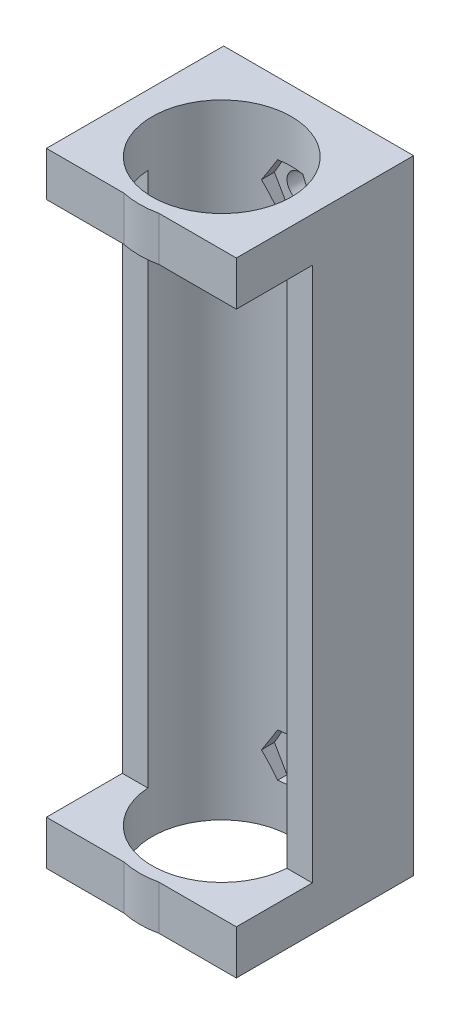
ISO-10303-21;
HEADER;
FILE_DESCRIPTION(('STEP AP214'),'2;1');
FILE_NAME('part.step','',(''),(''),'','','');
FILE_SCHEMA(('AUTOMOTIVE_DESIGN { 1 0 10303 214 1 1 1 1 }'));
ENDSEC;
DATA;
#1=APPLICATION_CONTEXT('core data for automotive mechanical design processes');
#2=APPLICATION_PROTOCOL_DEFINITION('international standard','automotive_design',2000,#1);
#3=PRODUCT_CONTEXT('',#1,'mechanical');
#4=PRODUCT('Part','Part','',(#3));
#5=PRODUCT_RELATED_PRODUCT_CATEGORY('part','',(#4));
#6=PRODUCT_DEFINITION_FORMATION('','',#4);
#7=PRODUCT_DEFINITION_CONTEXT('part definition',#1,'design');
#8=PRODUCT_DEFINITION('design','',#6,#7);
#9=PRODUCT_DEFINITION_SHAPE('','',#8);
#10=(LENGTH_UNIT() NAMED_UNIT(*) SI_UNIT(.MILLI.,.METRE.));
#11=(NAMED_UNIT(*) PLANE_ANGLE_UNIT() SI_UNIT($,.RADIAN.));
#12=(NAMED_UNIT(*) SI_UNIT($,.STERADIAN.) SOLID_ANGLE_UNIT());
#13=UNCERTAINTY_MEASURE_WITH_UNIT(LENGTH_MEASURE(1.E-05),#10,'distance_accuracy_value','');
#14=(GEOMETRIC_REPRESENTATION_CONTEXT(3) GLOBAL_UNCERTAINTY_ASSIGNED_CONTEXT((#13)) GLOBAL_UNIT_ASSIGNED_CONTEXT((#10,
#11,#12)) REPRESENTATION_CONTEXT('',''));
#15=CARTESIAN_POINT('',(0.,0.,0.));
#16=DIRECTION('',(0.,0.,1.));
#17=DIRECTION('',(1.,0.,0.));
#18=AXIS2_PLACEMENT_3D('',#15,#16,#17);
#19=CARTESIAN_POINT('',(-330.,-161.000000000004,4.));
#20=DIRECTION('',(0.,0.,-1.));
#21=DIRECTION('',(-1.,0.,0.));
#22=AXIS2_PLACEMENT_3D('',#19,#20,#21);
#23=CYLINDRICAL_SURFACE('',#22,2.);
#24=CARTESIAN_POINT('',(-330.,-161.000000000004,0.));
#25=DIRECTION('',(0.,0.,1.));
#26=DIRECTION('',(1.,0.,0.));
#27=AXIS2_PLACEMENT_3D('',#24,#25,#26);
#28=CIRCLE('',#27,2.);
#29=CARTESIAN_POINT('',(-328.,-161.000000000004,0.));
#30=VERTEX_POINT('',#29);
#31=EDGE_CURVE('E255',#30,#30,#28,.T.);
#32=ORIENTED_EDGE('',*,*,#31,.F.);
#33=EDGE_LOOP('',(#32));
#34=FACE_BOUND('',#33,.T.);
#35=CARTESIAN_POINT('',(-330.,-161.000000000004,3.));
#36=DIRECTION('',(0.,0.,1.));
#37=DIRECTION('',(1.,0.,0.));
#38=AXIS2_PLACEMENT_3D('',#35,#36,#37);
#39=CIRCLE('',#38,2.);
#40=CARTESIAN_POINT('',(-328.,-161.000000000004,3.));
#41=VERTEX_POINT('',#40);
#42=EDGE_CURVE('E40',#41,#41,#39,.T.);
#43=ORIENTED_EDGE('',*,*,#42,.T.);
#44=EDGE_LOOP('',(#43));
#45=FACE_BOUND('',#44,.T.);
#46=ADVANCED_FACE('F36',(#34,#45),#23,.F.);
#47=CARTESIAN_POINT('',(-330.,-238.999999999996,4.));
#48=DIRECTION('',(0.,0.,-1.));
#49=DIRECTION('',(-1.,0.,0.));
#50=AXIS2_PLACEMENT_3D('',#47,#48,#49);
#51=CYLINDRICAL_SURFACE('',#50,2.);
#52=CARTESIAN_POINT('',(-330.,-238.999999999996,0.));
#53=DIRECTION('',(0.,0.,1.));
#54=DIRECTION('',(1.,0.,0.));
#55=AXIS2_PLACEMENT_3D('',#52,#53,#54);
#56=CIRCLE('',#55,2.);
#57=CARTESIAN_POINT('',(-328.,-238.999999999996,0.));
#58=VERTEX_POINT('',#57);
#59=EDGE_CURVE('E251',#58,#58,#56,.T.);
#60=ORIENTED_EDGE('',*,*,#59,.F.);
#61=EDGE_LOOP('',(#60));
#62=FACE_BOUND('',#61,.T.);
#63=CARTESIAN_POINT('',(-330.,-238.999999999996,3.));
#64=DIRECTION('',(0.,0.,1.));
#65=DIRECTION('',(1.,0.,0.));
#66=AXIS2_PLACEMENT_3D('',#63,#64,#65);
#67=CIRCLE('',#66,2.);
#68=CARTESIAN_POINT('',(-328.,-238.999999999996,3.));
#69=VERTEX_POINT('',#68);
#70=EDGE_CURVE('E161',#69,#69,#67,.T.);
#71=ORIENTED_EDGE('',*,*,#70,.T.);
#72=EDGE_LOOP('',(#71));
#73=FACE_BOUND('',#72,.T.);
#74=ADVANCED_FACE('F527',(#62,#73),#51,.F.);
#75=CARTESIAN_POINT('',(-329.999999999999,-249.249999999996,15.3005851162431));
#76=DIRECTION('',(0.,1.,0.));
#77=DIRECTION('',(-1.,0.,0.));
#78=AXIS2_PLACEMENT_3D('',#75,#76,#77);
#79=CYLINDRICAL_SURFACE('',#78,11.);
#80=CARTESIAN_POINT('',(-329.999999999999,-235.549999999996,15.3005851162431));
#81=DIRECTION('',(0.,-1.,0.));
#82=DIRECTION('',(0.,0.,-1.));
#83=AXIS2_PLACEMENT_3D('',#80,#81,#82);
#84=CIRCLE('',#83,11.);
#85=CARTESIAN_POINT('',(-328.008141571296,-235.549999999996,4.48242908113241));
#86=VERTEX_POINT('',#85);
#87=CARTESIAN_POINT('',(-331.991858428704,-235.549999999996,4.48242908113259));
#88=VERTEX_POINT('',#87);
#89=EDGE_CURVE('E184',#86,#88,#84,.F.);
#90=ORIENTED_EDGE('',*,*,#89,.F.);
#91=CARTESIAN_POINT('',(-329.999999999999,-232.099999999997,15.3005851162431));
#92=DIRECTION('',(-0.866025403784441,-0.499999999999997,0.));
#93=DIRECTION('',(-0.499999999999997,0.866025403784441,0.));
#94=AXIS2_PLACEMENT_3D('',#91,#92,#93);
#95=ELLIPSE('',#94,22.,11.);
#96=CARTESIAN_POINT('',(-326.016283142591,-238.999999999996,5.04729296201264));
#97=VERTEX_POINT('',#96);
#98=EDGE_CURVE('E201',#97,#86,#95,.F.);
#99=ORIENTED_EDGE('',*,*,#98,.F.);
#100=CARTESIAN_POINT('',(-329.999999999999,-245.899999999995,15.3005851162431));
#101=DIRECTION('',(-0.866025403784441,0.499999999999997,0.));
#102=DIRECTION('',(0.499999999999997,0.866025403784441,0.));
#103=AXIS2_PLACEMENT_3D('',#100,#101,#102);
#104=ELLIPSE('',#103,22.0000000000003,11.);
#105=CARTESIAN_POINT('',(-328.008141571296,-242.449999999996,4.48242908113243));
#106=VERTEX_POINT('',#105);
#107=EDGE_CURVE('E197',#106,#97,#104,.F.);
#108=ORIENTED_EDGE('',*,*,#107,.F.);
#109=CARTESIAN_POINT('',(-329.999999999999,-242.449999999996,15.3005851162431));
#110=DIRECTION('',(0.,1.,0.));
#111=DIRECTION('',(-1.,0.,0.));
#112=AXIS2_PLACEMENT_3D('',#109,#110,#111);
#113=CIRCLE('',#112,11.);
#114=CARTESIAN_POINT('',(-331.991858428704,-242.449999999996,4.4824290811326));
#115=VERTEX_POINT('',#114);
#116=EDGE_CURVE('E194',#115,#106,#113,.F.);
#117=ORIENTED_EDGE('',*,*,#116,.F.);
#118=CARTESIAN_POINT('',(-329.999999999999,-245.899999999996,15.3005851162431));
#119=DIRECTION('',(0.866025403784434,0.500000000000009,0.));
#120=DIRECTION('',(-0.500000000000009,0.866025403784434,0.));
#121=AXIS2_PLACEMENT_3D('',#118,#119,#120);
#122=ELLIPSE('',#121,21.9999999999994,11.);
#123=CARTESIAN_POINT('',(-333.983716857408,-238.999999999996,5.04729296201301));
#124=VERTEX_POINT('',#123);
#125=EDGE_CURVE('E191',#124,#115,#122,.F.);
#126=ORIENTED_EDGE('',*,*,#125,.F.);
#127=CARTESIAN_POINT('',(-329.999999999999,-232.099999999995,15.3005851162431));
#128=DIRECTION('',(0.866025403784444,-0.499999999999991,0.));
#129=DIRECTION('',(0.499999999999991,0.866025403784444,0.));
#130=AXIS2_PLACEMENT_3D('',#127,#128,#129);
#131=ELLIPSE('',#130,22.0000000000006,11.);
#132=EDGE_CURVE('E188',#88,#124,#131,.F.);
#133=ORIENTED_EDGE('',*,*,#132,.F.);
#134=EDGE_LOOP('',(#90,#99,#108,#117,#126,#133));
#135=FACE_BOUND('',#134,.T.);
#136=CARTESIAN_POINT('',(-329.999999999999,-249.249999999996,15.3005851162431));
#137=DIRECTION('',(0.,-1.,0.));
#138=DIRECTION('',(1.,0.,0.));
#139=AXIS2_PLACEMENT_3D('',#136,#137,#138);
#140=CIRCLE('',#139,11.);
#141=CARTESIAN_POINT('',(-318.999999999999,-249.249999999996,15.3005851162431));
#142=VERTEX_POINT('',#141);
#143=EDGE_CURVE('E250',#142,#142,#140,.F.);
#144=ORIENTED_EDGE('',*,*,#143,.F.);
#145=EDGE_LOOP('',(#144));
#146=FACE_BOUND('',#145,.T.);
#147=CARTESIAN_POINT('',(-329.999999999999,-150.750000000004,15.300585116243));
#148=DIRECTION('',(0.,-1.,0.));
#149=DIRECTION('',(1.,0.,0.));
#150=AXIS2_PLACEMENT_3D('',#147,#148,#149);
#151=CIRCLE('',#150,11.);
#152=CARTESIAN_POINT('',(-318.999999999999,-150.750000000004,15.300585116243));
#153=VERTEX_POINT('',#152);
#154=EDGE_CURVE('E322',#153,#153,#151,.F.);
#155=ORIENTED_EDGE('',*,*,#154,.T.);
#156=EDGE_LOOP('',(#155));
#157=FACE_BOUND('',#156,.T.);
#158=CARTESIAN_POINT('',(-329.999999999999,-242.249999999996,15.3005851162431));
#159=DIRECTION('',(0.,-1.,0.));
#160=DIRECTION('',(0.,0.,-1.));
#161=AXIS2_PLACEMENT_3D('',#158,#159,#160);
#162=CIRCLE('',#161,11.);
#163=CARTESIAN_POINT('',(-319.022258027245,-242.249999999996,16.0000000000002));
#164=VERTEX_POINT('',#163);
#165=CARTESIAN_POINT('',(-340.977741972754,-242.249999999996,16.0000000000002));
#166=VERTEX_POINT('',#165);
#167=EDGE_CURVE('E317',#164,#166,#162,.T.);
#168=ORIENTED_EDGE('',*,*,#167,.F.);
#169=DIRECTION('',(0.,1.,0.));
#170=VECTOR('',#169,1.);
#171=CARTESIAN_POINT('',(-319.022258027245,-249.249999999996,16.0000000000002));
#172=LINE('',#171,#170);
#173=CARTESIAN_POINT('',(-319.022258027244,-157.750000000004,16.));
#174=VERTEX_POINT('',#173);
#175=EDGE_CURVE('E209',#174,#164,#172,.F.);
#176=ORIENTED_EDGE('',*,*,#175,.F.);
#177=CARTESIAN_POINT('',(-329.999999999999,-157.750000000004,15.300585116243));
#178=DIRECTION('',(0.,-1.,0.));
#179=DIRECTION('',(1.,0.,0.));
#180=AXIS2_PLACEMENT_3D('',#177,#178,#179);
#181=CIRCLE('',#180,11.);
#182=CARTESIAN_POINT('',(-340.977741972754,-157.750000000004,16.));
#183=VERTEX_POINT('',#182);
#184=EDGE_CURVE('E208',#174,#183,#181,.T.);
#185=ORIENTED_EDGE('',*,*,#184,.T.);
#186=DIRECTION('',(0.,1.,0.));
#187=VECTOR('',#186,1.);
#188=CARTESIAN_POINT('',(-340.977741972754,-249.249999999996,16.0000000000002));
#189=LINE('',#188,#187);
#190=EDGE_CURVE('E204',#166,#183,#189,.T.);
#191=ORIENTED_EDGE('',*,*,#190,.F.);
#192=EDGE_LOOP('',(#168,#176,#185,#191));
#193=FACE_BOUND('',#192,.T.);
#194=CARTESIAN_POINT('',(-329.999999999999,-164.450000000004,15.300585116243));
#195=DIRECTION('',(0.,1.,0.));
#196=DIRECTION('',(0.,0.,1.));
#197=AXIS2_PLACEMENT_3D('',#194,#195,#196);
#198=CIRCLE('',#197,11.);
#199=CARTESIAN_POINT('',(-331.991858428704,-164.450000000004,4.48242908113253));
#200=VERTEX_POINT('',#199);
#201=CARTESIAN_POINT('',(-328.008141571296,-164.450000000004,4.48242908113222));
#202=VERTEX_POINT('',#201);
#203=EDGE_CURVE('E59',#200,#202,#198,.F.);
#204=ORIENTED_EDGE('',*,*,#203,.F.);
#205=CARTESIAN_POINT('',(-329.999999999999,-167.900000000006,15.300585116243));
#206=DIRECTION('',(0.866025403784442,0.499999999999995,0.));
#207=DIRECTION('',(-0.499999999999995,0.866025403784442,0.));
#208=AXIS2_PLACEMENT_3D('',#205,#206,#207);
#209=ELLIPSE('',#208,22.,11.);
#210=CARTESIAN_POINT('',(-333.983716857408,-161.000000000004,5.04729296201305));
#211=VERTEX_POINT('',#210);
#212=EDGE_CURVE('E170',#211,#200,#209,.F.);
#213=ORIENTED_EDGE('',*,*,#212,.F.);
#214=CARTESIAN_POINT('',(-329.999999999999,-154.100000000003,15.300585116243));
#215=DIRECTION('',(0.866025403784447,-0.499999999999986,0.));
#216=DIRECTION('',(0.499999999999986,0.866025403784447,0.));
#217=AXIS2_PLACEMENT_3D('',#214,#215,#216);
#218=ELLIPSE('',#217,22.0000000000008,11.);
#219=CARTESIAN_POINT('',(-331.991858428704,-157.550000000004,4.48242908113253));
#220=VERTEX_POINT('',#219);
#221=EDGE_CURVE('E168',#220,#211,#218,.F.);
#222=ORIENTED_EDGE('',*,*,#221,.F.);
#223=CARTESIAN_POINT('',(-329.999999999999,-157.550000000004,15.300585116243));
#224=DIRECTION('',(0.,-1.,0.));
#225=DIRECTION('',(0.,0.,-1.));
#226=AXIS2_PLACEMENT_3D('',#223,#224,#225);
#227=CIRCLE('',#226,11.);
#228=CARTESIAN_POINT('',(-328.008141571296,-157.550000000004,4.48242908113219));
#229=VERTEX_POINT('',#228);
#230=EDGE_CURVE('E165',#229,#220,#227,.F.);
#231=ORIENTED_EDGE('',*,*,#230,.F.);
#232=CARTESIAN_POINT('',(-329.999999999999,-154.100000000006,15.300585116243));
#233=DIRECTION('',(-0.866025403784442,-0.499999999999995,0.));
#234=DIRECTION('',(-0.499999999999995,0.866025403784442,0.));
#235=AXIS2_PLACEMENT_3D('',#232,#233,#234);
#236=ELLIPSE('',#235,22.,11.);
#237=CARTESIAN_POINT('',(-326.016283142592,-161.000000000004,5.04729296201236));
#238=VERTEX_POINT('',#237);
#239=EDGE_CURVE('E133',#238,#229,#236,.F.);
#240=ORIENTED_EDGE('',*,*,#239,.F.);
#241=CARTESIAN_POINT('',(-329.999999999999,-167.900000000003,15.300585116243));
#242=DIRECTION('',(-0.866025403784441,0.499999999999997,0.));
#243=DIRECTION('',(0.499999999999997,0.866025403784441,0.));
#244=AXIS2_PLACEMENT_3D('',#241,#242,#243);
#245=ELLIPSE('',#244,22.0000000000003,11.);
#246=EDGE_CURVE('E137',#202,#238,#245,.F.);
#247=ORIENTED_EDGE('',*,*,#246,.F.);
#248=EDGE_LOOP('',(#204,#213,#222,#231,#240,#247));
#249=FACE_BOUND('',#248,.T.);
#250=ADVANCED_FACE('F38',(#135,#146,#157,#193,#249),#79,.F.);
#251=CARTESIAN_POINT('',(-345.,-274.560988842803,16.0000000000002));
#252=DIRECTION('',(0.,0.,-1.));
#253=DIRECTION('',(0.,1.,0.));
#254=AXIS2_PLACEMENT_3D('',#251,#252,#253);
#255=PLANE('',#254);
#256=DIRECTION('',(-1.,0.,0.));
#257=VECTOR('',#256,1.);
#258=CARTESIAN_POINT('',(-345.,-242.249999999996,16.0000000000002));
#259=LINE('',#258,#257);
#260=CARTESIAN_POINT('',(-345.,-242.249999999996,16.0000000000002));
#261=VERTEX_POINT('',#260);
#262=EDGE_CURVE('E289',#166,#261,#259,.T.);
#263=ORIENTED_EDGE('',*,*,#262,.F.);
#264=ORIENTED_EDGE('',*,*,#190,.T.);
#265=DIRECTION('',(-1.,0.,0.));
#266=VECTOR('',#265,1.);
#267=CARTESIAN_POINT('',(-345.,-157.750000000004,16.));
#268=LINE('',#267,#266);
#269=CARTESIAN_POINT('',(-345.,-157.750000000004,16.));
#270=VERTEX_POINT('',#269);
#271=EDGE_CURVE('E207',#183,#270,#268,.T.);
#272=ORIENTED_EDGE('',*,*,#271,.T.);
#273=DIRECTION('',(0.,1.,0.));
#274=VECTOR('',#273,1.);
#275=CARTESIAN_POINT('',(-345.,-274.560988842803,16.0000000000002));
#276=LINE('',#275,#274);
#277=EDGE_CURVE('E246',#261,#270,#276,.T.);
#278=ORIENTED_EDGE('',*,*,#277,.F.);
#279=EDGE_LOOP('',(#263,#264,#272,#278));
#280=FACE_BOUND('',#279,.T.);
#281=ADVANCED_FACE('F462',(#280),#255,.F.);
#282=CARTESIAN_POINT('',(-329.999999999999,-157.750000000004,15.300585116243));
#283=DIRECTION('',(0.,-1.,0.));
#284=DIRECTION('',(1.,0.,0.));
#285=AXIS2_PLACEMENT_3D('',#282,#283,#284);
#286=PLANE('',#285);
#287=ORIENTED_EDGE('',*,*,#184,.F.);
#288=CARTESIAN_POINT('',(-315.,-157.750000000004,16.));
#289=VERTEX_POINT('',#288);
#290=EDGE_CURVE('E212',#289,#174,#268,.T.);
#291=ORIENTED_EDGE('',*,*,#290,.F.);
#292=DIRECTION('',(0.,0.,-1.));
#293=VECTOR('',#292,1.);
#294=CARTESIAN_POINT('',(-315.,-157.750000000004,28.));
#295=LINE('',#294,#293);
#296=CARTESIAN_POINT('',(-315.,-157.750000000004,28.));
#297=VERTEX_POINT('',#296);
#298=EDGE_CURVE('E237',#297,#289,#295,.T.);
#299=ORIENTED_EDGE('',*,*,#298,.F.);
#300=DIRECTION('',(-1.,0.,0.));
#301=VECTOR('',#300,1.);
#302=CARTESIAN_POINT('',(0.,-157.750000000004,28.));
#303=LINE('',#302,#301);
#304=CARTESIAN_POINT('',(-327.2206364739,-157.750000000004,28.));
#305=VERTEX_POINT('',#304);
#306=EDGE_CURVE('E227',#297,#305,#303,.T.);
#307=ORIENTED_EDGE('',*,*,#306,.T.);
#308=CARTESIAN_POINT('',(-329.999999999999,-157.750000000004,15.300585116243));
#309=DIRECTION('',(0.,-1.,0.));
#310=DIRECTION('',(1.,0.,0.));
#311=AXIS2_PLACEMENT_3D('',#308,#309,#310);
#312=CIRCLE('',#311,13.);
#313=CARTESIAN_POINT('',(-332.779363526098,-157.750000000004,28.));
#314=VERTEX_POINT('',#313);
#315=EDGE_CURVE('E223',#305,#314,#312,.T.);
#316=ORIENTED_EDGE('',*,*,#315,.T.);
#317=CARTESIAN_POINT('',(-345.,-157.750000000004,28.));
#318=VERTEX_POINT('',#317);
#319=EDGE_CURVE('E226',#314,#318,#303,.T.);
#320=ORIENTED_EDGE('',*,*,#319,.T.);
#321=DIRECTION('',(0.,0.,-1.));
#322=VECTOR('',#321,1.);
#323=CARTESIAN_POINT('',(-345.,-157.750000000004,28.));
#324=LINE('',#323,#322);
#325=EDGE_CURVE('E296',#318,#270,#324,.T.);
#326=ORIENTED_EDGE('',*,*,#325,.T.);
#327=ORIENTED_EDGE('',*,*,#271,.F.);
#328=EDGE_LOOP('',(#287,#291,#299,#307,#316,#320,#326,#327));
#329=FACE_BOUND('',#328,.T.);
#330=ADVANCED_FACE('F494',(#329),#286,.T.);
#331=CARTESIAN_POINT('',(0.,-242.249999999996,28.));
#332=DIRECTION('',(0.,-1.,0.));
#333=DIRECTION('',(0.,0.,-1.));
#334=AXIS2_PLACEMENT_3D('',#331,#332,#333);
#335=PLANE('',#334);
#336=CARTESIAN_POINT('',(-315.,-242.249999999996,16.0000000000002));
#337=VERTEX_POINT('',#336);
#338=EDGE_CURVE('E299',#337,#164,#259,.T.);
#339=ORIENTED_EDGE('',*,*,#338,.T.);
#340=ORIENTED_EDGE('',*,*,#167,.T.);
#341=ORIENTED_EDGE('',*,*,#262,.T.);
#342=DIRECTION('',(0.,0.,-1.));
#343=VECTOR('',#342,1.);
#344=CARTESIAN_POINT('',(-345.,-242.249999999996,28.));
#345=LINE('',#344,#343);
#346=CARTESIAN_POINT('',(-345.,-242.249999999996,28.));
#347=VERTEX_POINT('',#346);
#348=EDGE_CURVE('E261',#347,#261,#345,.T.);
#349=ORIENTED_EDGE('',*,*,#348,.F.);
#350=DIRECTION('',(-1.,0.,0.));
#351=VECTOR('',#350,1.);
#352=CARTESIAN_POINT('',(0.,-242.249999999996,28.));
#353=LINE('',#352,#351);
#354=CARTESIAN_POINT('',(-332.779363526099,-242.249999999996,28.));
#355=VERTEX_POINT('',#354);
#356=EDGE_CURVE('E221',#355,#347,#353,.T.);
#357=ORIENTED_EDGE('',*,*,#356,.F.);
#358=CARTESIAN_POINT('',(-329.999999999999,-242.249999999996,15.3005851162431));
#359=DIRECTION('',(0.,1.,0.));
#360=DIRECTION('',(-1.,0.,0.));
#361=AXIS2_PLACEMENT_3D('',#358,#359,#360);
#362=CIRCLE('',#361,13.);
#363=CARTESIAN_POINT('',(-327.220636473899,-242.249999999996,28.));
#364=VERTEX_POINT('',#363);
#365=EDGE_CURVE('E271',#355,#364,#362,.T.);
#366=ORIENTED_EDGE('',*,*,#365,.T.);
#367=CARTESIAN_POINT('',(-315.,-242.249999999996,28.));
#368=VERTEX_POINT('',#367);
#369=EDGE_CURVE('E217',#368,#364,#353,.T.);
#370=ORIENTED_EDGE('',*,*,#369,.F.);
#371=DIRECTION('',(0.,0.,-1.));
#372=VECTOR('',#371,1.);
#373=CARTESIAN_POINT('',(-315.,-242.249999999996,28.));
#374=LINE('',#373,#372);
#375=EDGE_CURVE('E268',#368,#337,#374,.T.);
#376=ORIENTED_EDGE('',*,*,#375,.T.);
#377=EDGE_LOOP('',(#339,#340,#341,#349,#357,#366,#370,#376));
#378=FACE_BOUND('',#377,.T.);
#379=ADVANCED_FACE('F458',(#378),#335,.F.);
#380=CARTESIAN_POINT('',(0.,0.,28.));
#381=DIRECTION('',(0.,0.,1.));
#382=DIRECTION('',(1.,0.,0.));
#383=AXIS2_PLACEMENT_3D('',#380,#381,#382);
#384=PLANE('',#383);
#385=ORIENTED_EDGE('',*,*,#369,.T.);
#386=DIRECTION('',(0.,1.,0.));
#387=VECTOR('',#386,1.);
#388=CARTESIAN_POINT('',(-327.220636473899,-286.019552621696,28.));
#389=LINE('',#388,#387);
#390=CARTESIAN_POINT('',(-327.220636473899,-249.249999999996,28.));
#391=VERTEX_POINT('',#390);
#392=EDGE_CURVE('E213',#364,#391,#389,.F.);
#393=ORIENTED_EDGE('',*,*,#392,.T.);
#394=DIRECTION('',(1.,0.,0.));
#395=VECTOR('',#394,1.);
#396=CARTESIAN_POINT('',(0.,-249.249999999996,28.));
#397=LINE('',#396,#395);
#398=CARTESIAN_POINT('',(-315.,-249.249999999996,28.));
#399=VERTEX_POINT('',#398);
#400=EDGE_CURVE('E216',#391,#399,#397,.T.);
#401=ORIENTED_EDGE('',*,*,#400,.T.);
#402=DIRECTION('',(0.,1.,0.));
#403=VECTOR('',#402,1.);
#404=CARTESIAN_POINT('',(-315.,-1.77522970942616E-13,28.));
#405=LINE('',#404,#403);
#406=EDGE_CURVE('E276',#399,#368,#405,.T.);
#407=ORIENTED_EDGE('',*,*,#406,.T.);
#408=EDGE_LOOP('',(#385,#393,#401,#407));
#409=FACE_BOUND('',#408,.T.);
#410=ADVANCED_FACE('F479',(#409),#384,.T.);
#411=CARTESIAN_POINT('',(-345.,-249.249999999996,28.));
#412=VERTEX_POINT('',#411);
#413=CARTESIAN_POINT('',(-332.779363526099,-249.249999999996,28.));
#414=VERTEX_POINT('',#413);
#415=EDGE_CURVE('E222',#412,#414,#397,.T.);
#416=ORIENTED_EDGE('',*,*,#415,.T.);
#417=DIRECTION('',(0.,1.,0.));
#418=VECTOR('',#417,1.);
#419=CARTESIAN_POINT('',(-332.7793635261,-286.019552621696,28.));
#420=LINE('',#419,#418);
#421=EDGE_CURVE('E218',#414,#355,#420,.T.);
#422=ORIENTED_EDGE('',*,*,#421,.T.);
#423=ORIENTED_EDGE('',*,*,#356,.T.);
#424=DIRECTION('',(0.,-1.,0.));
#425=VECTOR('',#424,1.);
#426=CARTESIAN_POINT('',(-345.,-1.94429920556199E-13,28.));
#427=LINE('',#426,#425);
#428=EDGE_CURVE('E277',#347,#412,#427,.T.);
#429=ORIENTED_EDGE('',*,*,#428,.T.);
#430=EDGE_LOOP('',(#416,#422,#423,#429));
#431=FACE_BOUND('',#430,.T.);
#432=ADVANCED_FACE('F471',(#431),#384,.T.);
#433=CARTESIAN_POINT('',(-330.,-286.019552621696,15.3005851162432));
#434=DIRECTION('',(0.,1.,0.));
#435=DIRECTION('',(-1.,0.,0.));
#436=AXIS2_PLACEMENT_3D('',#433,#434,#435);
#437=CYLINDRICAL_SURFACE('',#436,13.);
#438=ORIENTED_EDGE('',*,*,#315,.F.);
#439=DIRECTION('',(0.,1.,0.));
#440=VECTOR('',#439,1.);
#441=CARTESIAN_POINT('',(-327.220636473899,-286.019552621696,28.));
#442=LINE('',#441,#440);
#443=CARTESIAN_POINT('',(-327.2206364739,-150.750000000004,28.));
#444=VERTEX_POINT('',#443);
#445=EDGE_CURVE('E232',#305,#444,#442,.T.);
#446=ORIENTED_EDGE('',*,*,#445,.T.);
#447=CARTESIAN_POINT('',(-329.999999999999,-150.750000000004,15.3005851162429));
#448=DIRECTION('',(0.,-1.,0.));
#449=DIRECTION('',(1.,0.,0.));
#450=AXIS2_PLACEMENT_3D('',#447,#448,#449);
#451=CIRCLE('',#450,13.);
#452=CARTESIAN_POINT('',(-332.779363526098,-150.750000000004,28.));
#453=VERTEX_POINT('',#452);
#454=EDGE_CURVE('E228',#444,#453,#451,.T.);
#455=ORIENTED_EDGE('',*,*,#454,.T.);
#456=DIRECTION('',(0.,1.,0.));
#457=VECTOR('',#456,1.);
#458=CARTESIAN_POINT('',(-332.7793635261,-286.019552621696,28.));
#459=LINE('',#458,#457);
#460=EDGE_CURVE('E231',#453,#314,#459,.F.);
#461=ORIENTED_EDGE('',*,*,#460,.T.);
#462=EDGE_LOOP('',(#438,#446,#455,#461));
#463=FACE_BOUND('',#462,.T.);
#464=ADVANCED_FACE('F515',(#463),#437,.T.);
#465=CARTESIAN_POINT('',(-329.999999999999,-150.750000000004,15.3005851162429));
#466=DIRECTION('',(0.,-1.,0.));
#467=DIRECTION('',(1.,0.,0.));
#468=AXIS2_PLACEMENT_3D('',#465,#466,#467);
#469=PLANE('',#468);
#470=ORIENTED_EDGE('',*,*,#154,.F.);
#471=EDGE_LOOP('',(#470));
#472=FACE_BOUND('',#471,.T.);
#473=ORIENTED_EDGE('',*,*,#454,.F.);
#474=DIRECTION('',(-1.,0.,0.));
#475=VECTOR('',#474,1.);
#476=CARTESIAN_POINT('',(0.,-150.750000000004,28.));
#477=LINE('',#476,#475);
#478=CARTESIAN_POINT('',(-315.,-150.750000000004,28.));
#479=VERTEX_POINT('',#478);
#480=EDGE_CURVE('E304',#479,#444,#477,.T.);
#481=ORIENTED_EDGE('',*,*,#480,.F.);
#482=DIRECTION('',(0.,0.,-1.));
#483=VECTOR('',#482,1.);
#484=CARTESIAN_POINT('',(-315.,-150.750000000004,4.));
#485=LINE('',#484,#483);
#486=CARTESIAN_POINT('',(-315.,-150.750000000004,0.));
#487=VERTEX_POINT('',#486);
#488=EDGE_CURVE('E238',#479,#487,#485,.T.);
#489=ORIENTED_EDGE('',*,*,#488,.T.);
#490=DIRECTION('',(-1.,0.,0.));
#491=VECTOR('',#490,1.);
#492=CARTESIAN_POINT('',(0.,-150.750000000004,0.));
#493=LINE('',#492,#491);
#494=CARTESIAN_POINT('',(-345.,-150.750000000004,0.));
#495=VERTEX_POINT('',#494);
#496=EDGE_CURVE('E241',#487,#495,#493,.T.);
#497=ORIENTED_EDGE('',*,*,#496,.T.);
#498=DIRECTION('',(0.,0.,-1.));
#499=VECTOR('',#498,1.);
#500=CARTESIAN_POINT('',(-345.,-150.750000000004,4.));
#501=LINE('',#500,#499);
#502=CARTESIAN_POINT('',(-345.,-150.750000000004,28.));
#503=VERTEX_POINT('',#502);
#504=EDGE_CURVE('E242',#503,#495,#501,.T.);
#505=ORIENTED_EDGE('',*,*,#504,.F.);
#506=EDGE_CURVE('E286',#453,#503,#477,.T.);
#507=ORIENTED_EDGE('',*,*,#506,.F.);
#508=EDGE_LOOP('',(#473,#481,#489,#497,#505,#507));
#509=FACE_BOUND('',#508,.T.);
#510=ADVANCED_FACE('F513',(#472,#509),#469,.F.);
#511=CARTESIAN_POINT('',(0.,-249.249999999996,4.));
#512=DIRECTION('',(0.,-1.,0.));
#513=DIRECTION('',(0.,0.,-1.));
#514=AXIS2_PLACEMENT_3D('',#511,#512,#513);
#515=PLANE('',#514);
#516=ORIENTED_EDGE('',*,*,#143,.T.);
#517=EDGE_LOOP('',(#516));
#518=FACE_BOUND('',#517,.T.);
#519=ORIENTED_EDGE('',*,*,#400,.F.);
#520=CARTESIAN_POINT('',(-329.999999999999,-249.249999999996,15.3005851162431));
#521=DIRECTION('',(0.,1.,0.));
#522=DIRECTION('',(-1.,0.,0.));
#523=AXIS2_PLACEMENT_3D('',#520,#521,#522);
#524=CIRCLE('',#523,13.);
#525=EDGE_CURVE('E254',#414,#391,#524,.T.);
#526=ORIENTED_EDGE('',*,*,#525,.F.);
#527=ORIENTED_EDGE('',*,*,#415,.F.);
#528=DIRECTION('',(0.,0.,-1.));
#529=VECTOR('',#528,1.);
#530=CARTESIAN_POINT('',(-345.,-249.249999999996,4.));
#531=LINE('',#530,#529);
#532=CARTESIAN_POINT('',(-345.,-249.249999999996,0.));
#533=VERTEX_POINT('',#532);
#534=EDGE_CURVE('E247',#412,#533,#531,.T.);
#535=ORIENTED_EDGE('',*,*,#534,.T.);
#536=DIRECTION('',(-1.,0.,0.));
#537=VECTOR('',#536,1.);
#538=CARTESIAN_POINT('',(0.,-249.249999999996,0.));
#539=LINE('',#538,#537);
#540=CARTESIAN_POINT('',(-315.,-249.249999999996,0.));
#541=VERTEX_POINT('',#540);
#542=EDGE_CURVE('E245',#541,#533,#539,.T.);
#543=ORIENTED_EDGE('',*,*,#542,.F.);
#544=DIRECTION('',(0.,0.,-1.));
#545=VECTOR('',#544,1.);
#546=CARTESIAN_POINT('',(-315.,-249.249999999996,4.));
#547=LINE('',#546,#545);
#548=EDGE_CURVE('E233',#399,#541,#547,.T.);
#549=ORIENTED_EDGE('',*,*,#548,.F.);
#550=EDGE_LOOP('',(#519,#526,#527,#535,#543,#549));
#551=FACE_BOUND('',#550,.T.);
#552=ADVANCED_FACE('F482',(#518,#551),#515,.T.);
#553=CARTESIAN_POINT('',(-315.,-1.77522970942616E-13,4.));
#554=DIRECTION('',(1.,0.,0.));
#555=DIRECTION('',(0.,1.,0.));
#556=AXIS2_PLACEMENT_3D('',#553,#554,#555);
#557=PLANE('',#556);
#558=ORIENTED_EDGE('',*,*,#298,.T.);
#559=DIRECTION('',(0.,1.,0.));
#560=VECTOR('',#559,1.);
#561=CARTESIAN_POINT('',(-315.,-274.560988842803,16.0000000000002));
#562=LINE('',#561,#560);
#563=EDGE_CURVE('E203',#337,#289,#562,.T.);
#564=ORIENTED_EDGE('',*,*,#563,.F.);
#565=ORIENTED_EDGE('',*,*,#375,.F.);
#566=ORIENTED_EDGE('',*,*,#406,.F.);
#567=ORIENTED_EDGE('',*,*,#548,.T.);
#568=DIRECTION('',(0.,-1.,0.));
#569=VECTOR('',#568,1.);
#570=CARTESIAN_POINT('',(-315.,-1.77522970942616E-13,0.));
#571=LINE('',#570,#569);
#572=EDGE_CURVE('E258',#487,#541,#571,.T.);
#573=ORIENTED_EDGE('',*,*,#572,.F.);
#574=ORIENTED_EDGE('',*,*,#488,.F.);
#575=DIRECTION('',(0.,1.,0.));
#576=VECTOR('',#575,1.);
#577=CARTESIAN_POINT('',(-315.,-1.77522970942616E-13,28.));
#578=LINE('',#577,#576);
#579=EDGE_CURVE('E303',#297,#479,#578,.T.);
#580=ORIENTED_EDGE('',*,*,#579,.F.);
#581=EDGE_LOOP('',(#558,#564,#565,#566,#567,#573,#574,#580));
#582=FACE_BOUND('',#581,.T.);
#583=ADVANCED_FACE('F488',(#582),#557,.T.);
#584=CARTESIAN_POINT('',(-345.,-1.94429920556199E-13,4.));
#585=DIRECTION('',(1.,0.,0.));
#586=DIRECTION('',(0.,1.,0.));
#587=AXIS2_PLACEMENT_3D('',#584,#585,#586);
#588=PLANE('',#587);
#589=DIRECTION('',(0.,-1.,0.));
#590=VECTOR('',#589,1.);
#591=CARTESIAN_POINT('',(-345.,-1.94429920556199E-13,0.));
#592=LINE('',#591,#590);
#593=EDGE_CURVE('E236',#495,#533,#592,.T.);
#594=ORIENTED_EDGE('',*,*,#593,.T.);
#595=ORIENTED_EDGE('',*,*,#534,.F.);
#596=ORIENTED_EDGE('',*,*,#428,.F.);
#597=ORIENTED_EDGE('',*,*,#348,.T.);
#598=ORIENTED_EDGE('',*,*,#277,.T.);
#599=ORIENTED_EDGE('',*,*,#325,.F.);
#600=DIRECTION('',(0.,-1.,0.));
#601=VECTOR('',#600,1.);
#602=CARTESIAN_POINT('',(-345.,-1.94429920556199E-13,28.));
#603=LINE('',#602,#601);
#604=EDGE_CURVE('E300',#503,#318,#603,.T.);
#605=ORIENTED_EDGE('',*,*,#604,.F.);
#606=ORIENTED_EDGE('',*,*,#504,.T.);
#607=EDGE_LOOP('',(#594,#595,#596,#597,#598,#599,#605,#606));
#608=FACE_BOUND('',#607,.T.);
#609=ADVANCED_FACE('F465',(#608),#588,.F.);
#610=CARTESIAN_POINT('',(0.,0.,0.));
#611=DIRECTION('',(0.,0.,1.));
#612=DIRECTION('',(1.,0.,0.));
#613=AXIS2_PLACEMENT_3D('',#610,#611,#612);
#614=PLANE('',#613);
#615=ORIENTED_EDGE('',*,*,#542,.T.);
#616=ORIENTED_EDGE('',*,*,#593,.F.);
#617=ORIENTED_EDGE('',*,*,#496,.F.);
#618=ORIENTED_EDGE('',*,*,#572,.T.);
#619=EDGE_LOOP('',(#615,#616,#617,#618));
#620=FACE_BOUND('',#619,.T.);
#621=ORIENTED_EDGE('',*,*,#31,.T.);
#622=EDGE_LOOP('',(#621));
#623=FACE_BOUND('',#622,.T.);
#624=ORIENTED_EDGE('',*,*,#59,.T.);
#625=EDGE_LOOP('',(#624));
#626=FACE_BOUND('',#625,.T.);
#627=ADVANCED_FACE('F506',(#620,#623,#626),#614,.F.);
#628=CARTESIAN_POINT('',(-330.,-286.019552621696,15.3005851162432));
#629=DIRECTION('',(0.,1.,0.));
#630=DIRECTION('',(-1.,0.,0.));
#631=AXIS2_PLACEMENT_3D('',#628,#629,#630);
#632=CYLINDRICAL_SURFACE('',#631,13.);
#633=ORIENTED_EDGE('',*,*,#392,.F.);
#634=ORIENTED_EDGE('',*,*,#365,.F.);
#635=ORIENTED_EDGE('',*,*,#421,.F.);
#636=ORIENTED_EDGE('',*,*,#525,.T.);
#637=EDGE_LOOP('',(#633,#634,#635,#636));
#638=FACE_BOUND('',#637,.T.);
#639=ADVANCED_FACE('F476',(#638),#632,.T.);
#640=CARTESIAN_POINT('',(0.,0.,28.));
#641=DIRECTION('',(0.,0.,1.));
#642=DIRECTION('',(1.,0.,0.));
#643=AXIS2_PLACEMENT_3D('',#640,#641,#642);
#644=PLANE('',#643);
#645=ORIENTED_EDGE('',*,*,#460,.F.);
#646=ORIENTED_EDGE('',*,*,#506,.T.);
#647=ORIENTED_EDGE('',*,*,#604,.T.);
#648=ORIENTED_EDGE('',*,*,#319,.F.);
#649=EDGE_LOOP('',(#645,#646,#647,#648));
#650=FACE_BOUND('',#649,.T.);
#651=ADVANCED_FACE('F500',(#650),#644,.T.);
#652=ORIENTED_EDGE('',*,*,#445,.F.);
#653=ORIENTED_EDGE('',*,*,#306,.F.);
#654=ORIENTED_EDGE('',*,*,#579,.T.);
#655=ORIENTED_EDGE('',*,*,#480,.T.);
#656=EDGE_LOOP('',(#652,#653,#654,#655));
#657=FACE_BOUND('',#656,.T.);
#658=ADVANCED_FACE('F511',(#657),#644,.T.);
#659=ORIENTED_EDGE('',*,*,#290,.T.);
#660=ORIENTED_EDGE('',*,*,#175,.T.);
#661=ORIENTED_EDGE('',*,*,#338,.F.);
#662=ORIENTED_EDGE('',*,*,#563,.T.);
#663=EDGE_LOOP('',(#659,#660,#661,#662));
#664=FACE_BOUND('',#663,.T.);
#665=ADVANCED_FACE('F492',(#664),#255,.F.);
#666=CARTESIAN_POINT('',(-348.002248109183,-200.91919162443,13.));
#667=DIRECTION('',(-0.866025403784441,-0.499999999999997,0.));
#668=DIRECTION('',(0.499999999999997,-0.866025403784441,0.));
#669=AXIS2_PLACEMENT_3D('',#666,#667,#668);
#670=PLANE('',#669);
#671=ORIENTED_EDGE('',*,*,#98,.T.);
#672=DIRECTION('',(0.,0.,-1.));
#673=VECTOR('',#672,1.);
#674=CARTESIAN_POINT('',(-328.008141571296,-235.549999999996,13.));
#675=LINE('',#674,#673);
#676=CARTESIAN_POINT('',(-328.008141571296,-235.549999999996,3.));
#677=VERTEX_POINT('',#676);
#678=EDGE_CURVE('E200',#86,#677,#675,.T.);
#679=ORIENTED_EDGE('',*,*,#678,.T.);
#680=DIRECTION('',(-0.499999999999997,0.866025403784441,0.));
#681=VECTOR('',#680,1.);
#682=CARTESIAN_POINT('',(-348.002248109183,-200.91919162443,3.));
#683=LINE('',#682,#681);
#684=CARTESIAN_POINT('',(-326.016283142591,-238.999999999996,3.));
#685=VERTEX_POINT('',#684);
#686=EDGE_CURVE('E175',#685,#677,#683,.T.);
#687=ORIENTED_EDGE('',*,*,#686,.F.);
#688=DIRECTION('',(0.,0.,-1.));
#689=VECTOR('',#688,1.);
#690=CARTESIAN_POINT('',(-326.016283142591,-238.999999999996,13.));
#691=LINE('',#690,#689);
#692=EDGE_CURVE('E196',#97,#685,#691,.T.);
#693=ORIENTED_EDGE('',*,*,#692,.F.);
#694=EDGE_LOOP('',(#671,#679,#687,#693));
#695=FACE_BOUND('',#694,.T.);
#696=ADVANCED_FACE('F380',(#695),#670,.T.);
#697=CARTESIAN_POINT('',(-141.022176604707,81.4191916244336,13.));
#698=DIRECTION('',(-0.866025403784441,0.499999999999997,0.));
#699=DIRECTION('',(-0.499999999999997,-0.866025403784441,0.));
#700=AXIS2_PLACEMENT_3D('',#697,#698,#699);
#701=PLANE('',#700);
#702=ORIENTED_EDGE('',*,*,#107,.T.);
#703=ORIENTED_EDGE('',*,*,#692,.T.);
#704=DIRECTION('',(0.499999999999997,0.866025403784441,0.));
#705=VECTOR('',#704,1.);
#706=CARTESIAN_POINT('',(-141.022176604707,81.4191916244336,3.));
#707=LINE('',#706,#705);
#708=CARTESIAN_POINT('',(-328.008141571296,-242.449999999996,3.));
#709=VERTEX_POINT('',#708);
#710=EDGE_CURVE('E180',#709,#685,#707,.T.);
#711=ORIENTED_EDGE('',*,*,#710,.F.);
#712=DIRECTION('',(0.,0.,-1.));
#713=VECTOR('',#712,1.);
#714=CARTESIAN_POINT('',(-328.008141571296,-242.449999999996,13.));
#715=LINE('',#714,#713);
#716=EDGE_CURVE('E193',#106,#709,#715,.T.);
#717=ORIENTED_EDGE('',*,*,#716,.F.);
#718=EDGE_LOOP('',(#702,#703,#711,#717));
#719=FACE_BOUND('',#718,.T.);
#720=ADVANCED_FACE('F377',(#719),#701,.T.);
#721=CARTESIAN_POINT('',(-3.37842248778038E-12,-242.45,13.));
#722=DIRECTION('',(0.,1.,0.));
#723=DIRECTION('',(-1.,0.,0.));
#724=AXIS2_PLACEMENT_3D('',#721,#722,#723);
#725=PLANE('',#724);
#726=ORIENTED_EDGE('',*,*,#116,.T.);
#727=ORIENTED_EDGE('',*,*,#716,.T.);
#728=DIRECTION('',(1.,0.,0.));
#729=VECTOR('',#728,1.);
#730=CARTESIAN_POINT('',(-3.37842248778038E-12,-242.45,3.));
#731=LINE('',#730,#729);
#732=CARTESIAN_POINT('',(-331.991858428704,-242.449999999996,3.));
#733=VERTEX_POINT('',#732);
#734=EDGE_CURVE('E338',#733,#709,#731,.T.);
#735=ORIENTED_EDGE('',*,*,#734,.F.);
#736=DIRECTION('',(0.,0.,-1.));
#737=VECTOR('',#736,1.);
#738=CARTESIAN_POINT('',(-331.991858428704,-242.449999999996,13.));
#739=LINE('',#738,#737);
#740=EDGE_CURVE('E190',#115,#733,#739,.T.);
#741=ORIENTED_EDGE('',*,*,#740,.F.);
#742=EDGE_LOOP('',(#726,#727,#735,#741));
#743=FACE_BOUND('',#742,.T.);
#744=ADVANCED_FACE('F373',(#743),#725,.T.);
#745=CARTESIAN_POINT('',(-353.977823395293,-204.369191624435,13.));
#746=DIRECTION('',(0.866025403784434,0.500000000000009,0.));
#747=DIRECTION('',(-0.500000000000009,0.866025403784434,0.));
#748=AXIS2_PLACEMENT_3D('',#745,#746,#747);
#749=PLANE('',#748);
#750=ORIENTED_EDGE('',*,*,#125,.T.);
#751=ORIENTED_EDGE('',*,*,#740,.T.);
#752=DIRECTION('',(0.500000000000009,-0.866025403784434,0.));
#753=VECTOR('',#752,1.);
#754=CARTESIAN_POINT('',(-353.977823395293,-204.369191624435,3.));
#755=LINE('',#754,#753);
#756=CARTESIAN_POINT('',(-333.983716857408,-238.999999999996,3.));
#757=VERTEX_POINT('',#756);
#758=EDGE_CURVE('E341',#757,#733,#755,.T.);
#759=ORIENTED_EDGE('',*,*,#758,.F.);
#760=DIRECTION('',(0.,0.,-1.));
#761=VECTOR('',#760,1.);
#762=CARTESIAN_POINT('',(-333.983716857408,-238.999999999996,13.));
#763=LINE('',#762,#761);
#764=EDGE_CURVE('E187',#124,#757,#763,.T.);
#765=ORIENTED_EDGE('',*,*,#764,.F.);
#766=EDGE_LOOP('',(#750,#751,#759,#765));
#767=FACE_BOUND('',#766,.T.);
#768=ADVANCED_FACE('F364',(#767),#749,.T.);
#769=CARTESIAN_POINT('',(-146.997751890822,84.8691916244338,13.));
#770=DIRECTION('',(0.866025403784444,-0.499999999999991,0.));
#771=DIRECTION('',(0.499999999999991,0.866025403784444,0.));
#772=AXIS2_PLACEMENT_3D('',#769,#770,#771);
#773=PLANE('',#772);
#774=ORIENTED_EDGE('',*,*,#132,.T.);
#775=ORIENTED_EDGE('',*,*,#764,.T.);
#776=DIRECTION('',(-0.499999999999991,-0.866025403784444,0.));
#777=VECTOR('',#776,1.);
#778=CARTESIAN_POINT('',(-146.997751890822,84.8691916244338,3.));
#779=LINE('',#778,#777);
#780=CARTESIAN_POINT('',(-331.991858428704,-235.549999999996,3.));
#781=VERTEX_POINT('',#780);
#782=EDGE_CURVE('E344',#781,#757,#779,.T.);
#783=ORIENTED_EDGE('',*,*,#782,.F.);
#784=DIRECTION('',(0.,0.,-1.));
#785=VECTOR('',#784,1.);
#786=CARTESIAN_POINT('',(-331.991858428704,-235.549999999996,13.));
#787=LINE('',#786,#785);
#788=EDGE_CURVE('E186',#88,#781,#787,.T.);
#789=ORIENTED_EDGE('',*,*,#788,.F.);
#790=EDGE_LOOP('',(#774,#775,#783,#789));
#791=FACE_BOUND('',#790,.T.);
#792=ADVANCED_FACE('F360',(#791),#773,.T.);
#793=CARTESIAN_POINT('',(0.,-235.549999999996,13.));
#794=DIRECTION('',(0.,-1.,0.));
#795=DIRECTION('',(0.,0.,-1.));
#796=AXIS2_PLACEMENT_3D('',#793,#794,#795);
#797=PLANE('',#796);
#798=ORIENTED_EDGE('',*,*,#89,.T.);
#799=ORIENTED_EDGE('',*,*,#788,.T.);
#800=DIRECTION('',(-1.,0.,0.));
#801=VECTOR('',#800,1.);
#802=CARTESIAN_POINT('',(0.,-235.549999999996,3.));
#803=LINE('',#802,#801);
#804=EDGE_CURVE('E330',#677,#781,#803,.T.);
#805=ORIENTED_EDGE('',*,*,#804,.F.);
#806=ORIENTED_EDGE('',*,*,#678,.F.);
#807=EDGE_LOOP('',(#798,#799,#805,#806));
#808=FACE_BOUND('',#807,.T.);
#809=ADVANCED_FACE('F355',(#808),#797,.T.);
#810=CARTESIAN_POINT('',(0.,0.,3.));
#811=DIRECTION('',(0.,0.,1.));
#812=DIRECTION('',(1.,0.,0.));
#813=AXIS2_PLACEMENT_3D('',#810,#811,#812);
#814=PLANE('',#813);
#815=ORIENTED_EDGE('',*,*,#70,.F.);
#816=EDGE_LOOP('',(#815));
#817=FACE_BOUND('',#816,.T.);
#818=ORIENTED_EDGE('',*,*,#804,.T.);
#819=ORIENTED_EDGE('',*,*,#782,.T.);
#820=ORIENTED_EDGE('',*,*,#758,.T.);
#821=ORIENTED_EDGE('',*,*,#734,.T.);
#822=ORIENTED_EDGE('',*,*,#710,.T.);
#823=ORIENTED_EDGE('',*,*,#686,.T.);
#824=EDGE_LOOP('',(#818,#819,#820,#821,#822,#823));
#825=FACE_BOUND('',#824,.T.);
#826=ADVANCED_FACE('F349',(#817,#825),#814,.T.);
#827=CARTESIAN_POINT('',(-320.202832647707,-184.869191624432,13.));
#828=DIRECTION('',(0.866025403784442,0.499999999999995,0.));
#829=DIRECTION('',(-0.499999999999995,0.866025403784442,0.));
#830=AXIS2_PLACEMENT_3D('',#827,#828,#829);
#831=PLANE('',#830);
#832=ORIENTED_EDGE('',*,*,#212,.T.);
#833=DIRECTION('',(0.,0.,-1.));
#834=VECTOR('',#833,1.);
#835=CARTESIAN_POINT('',(-331.991858428704,-164.450000000004,13.));
#836=LINE('',#835,#834);
#837=CARTESIAN_POINT('',(-331.991858428704,-164.450000000004,3.));
#838=VERTEX_POINT('',#837);
#839=EDGE_CURVE('E169',#200,#838,#836,.T.);
#840=ORIENTED_EDGE('',*,*,#839,.T.);
#841=DIRECTION('',(0.499999999999995,-0.866025403784442,0.));
#842=VECTOR('',#841,1.);
#843=CARTESIAN_POINT('',(-320.202832647707,-184.869191624432,3.));
#844=LINE('',#843,#842);
#845=CARTESIAN_POINT('',(-333.983716857408,-161.000000000004,3.));
#846=VERTEX_POINT('',#845);
#847=EDGE_CURVE('E12',#846,#838,#844,.T.);
#848=ORIENTED_EDGE('',*,*,#847,.F.);
#849=DIRECTION('',(0.,0.,-1.));
#850=VECTOR('',#849,1.);
#851=CARTESIAN_POINT('',(-333.983716857408,-161.000000000004,13.));
#852=LINE('',#851,#850);
#853=EDGE_CURVE('E166',#211,#846,#852,.T.);
#854=ORIENTED_EDGE('',*,*,#853,.F.);
#855=EDGE_LOOP('',(#832,#840,#848,#854));
#856=FACE_BOUND('',#855,.T.);
#857=ADVANCED_FACE('F565',(#856),#831,.T.);
#858=CARTESIAN_POINT('',(-180.772742638413,104.369191624431,13.));
#859=DIRECTION('',(0.866025403784447,-0.499999999999986,0.));
#860=DIRECTION('',(0.499999999999986,0.866025403784447,0.));
#861=AXIS2_PLACEMENT_3D('',#858,#859,#860);
#862=PLANE('',#861);
#863=ORIENTED_EDGE('',*,*,#221,.T.);
#864=ORIENTED_EDGE('',*,*,#853,.T.);
#865=DIRECTION('',(-0.499999999999986,-0.866025403784447,0.));
#866=VECTOR('',#865,1.);
#867=CARTESIAN_POINT('',(-180.772742638413,104.369191624431,3.));
#868=LINE('',#867,#866);
#869=CARTESIAN_POINT('',(-331.991858428704,-157.550000000004,3.));
#870=VERTEX_POINT('',#869);
#871=EDGE_CURVE('E45',#870,#846,#868,.T.);
#872=ORIENTED_EDGE('',*,*,#871,.F.);
#873=DIRECTION('',(0.,0.,-1.));
#874=VECTOR('',#873,1.);
#875=CARTESIAN_POINT('',(-331.991858428704,-157.550000000004,13.));
#876=LINE('',#875,#874);
#877=EDGE_CURVE('E151',#220,#870,#876,.T.);
#878=ORIENTED_EDGE('',*,*,#877,.F.);
#879=EDGE_LOOP('',(#863,#864,#872,#878));
#880=FACE_BOUND('',#879,.T.);
#881=ADVANCED_FACE('F578',(#880),#862,.T.);
#882=CARTESIAN_POINT('',(0.,-157.550000000004,13.));
#883=DIRECTION('',(0.,-1.,0.));
#884=DIRECTION('',(0.,0.,-1.));
#885=AXIS2_PLACEMENT_3D('',#882,#883,#884);
#886=PLANE('',#885);
#887=ORIENTED_EDGE('',*,*,#230,.T.);
#888=ORIENTED_EDGE('',*,*,#877,.T.);
#889=DIRECTION('',(-1.,0.,0.));
#890=VECTOR('',#889,1.);
#891=CARTESIAN_POINT('',(0.,-157.550000000004,3.));
#892=LINE('',#891,#890);
#893=CARTESIAN_POINT('',(-328.008141571296,-157.550000000004,3.));
#894=VERTEX_POINT('',#893);
#895=EDGE_CURVE('E145',#894,#870,#892,.T.);
#896=ORIENTED_EDGE('',*,*,#895,.F.);
#897=DIRECTION('',(0.,0.,-1.));
#898=VECTOR('',#897,1.);
#899=CARTESIAN_POINT('',(-328.008141571296,-157.550000000004,13.));
#900=LINE('',#899,#898);
#901=EDGE_CURVE('E127',#229,#894,#900,.T.);
#902=ORIENTED_EDGE('',*,*,#901,.F.);
#903=EDGE_LOOP('',(#887,#888,#896,#902));
#904=FACE_BOUND('',#903,.T.);
#905=ADVANCED_FACE('F149',(#904),#886,.T.);
#906=CARTESIAN_POINT('',(-314.227257361594,-181.419191624432,13.));
#907=DIRECTION('',(-0.866025403784442,-0.499999999999995,0.));
#908=DIRECTION('',(0.499999999999995,-0.866025403784442,0.));
#909=AXIS2_PLACEMENT_3D('',#906,#907,#908);
#910=PLANE('',#909);
#911=ORIENTED_EDGE('',*,*,#239,.T.);
#912=ORIENTED_EDGE('',*,*,#901,.T.);
#913=DIRECTION('',(-0.499999999999995,0.866025403784442,0.));
#914=VECTOR('',#913,1.);
#915=CARTESIAN_POINT('',(-314.227257361594,-181.419191624432,3.));
#916=LINE('',#915,#914);
#917=CARTESIAN_POINT('',(-326.016283142592,-161.000000000004,3.));
#918=VERTEX_POINT('',#917);
#919=EDGE_CURVE('E131',#918,#894,#916,.T.);
#920=ORIENTED_EDGE('',*,*,#919,.F.);
#921=DIRECTION('',(0.,0.,-1.));
#922=VECTOR('',#921,1.);
#923=CARTESIAN_POINT('',(-326.016283142592,-161.000000000004,13.));
#924=LINE('',#923,#922);
#925=EDGE_CURVE('E157',#238,#918,#924,.T.);
#926=ORIENTED_EDGE('',*,*,#925,.F.);
#927=EDGE_LOOP('',(#911,#912,#920,#926));
#928=FACE_BOUND('',#927,.T.);
#929=ADVANCED_FACE('F129',(#928),#910,.T.);
#930=CARTESIAN_POINT('',(-174.797167352296,100.919191624431,13.));
#931=DIRECTION('',(-0.866025403784441,0.499999999999997,0.));
#932=DIRECTION('',(-0.499999999999997,-0.866025403784441,0.));
#933=AXIS2_PLACEMENT_3D('',#930,#931,#932);
#934=PLANE('',#933);
#935=ORIENTED_EDGE('',*,*,#246,.T.);
#936=ORIENTED_EDGE('',*,*,#925,.T.);
#937=DIRECTION('',(0.499999999999997,0.866025403784441,0.));
#938=VECTOR('',#937,1.);
#939=CARTESIAN_POINT('',(-174.797167352296,100.919191624431,3.));
#940=LINE('',#939,#938);
#941=CARTESIAN_POINT('',(-328.008141571296,-164.450000000004,3.));
#942=VERTEX_POINT('',#941);
#943=EDGE_CURVE('E147',#942,#918,#940,.T.);
#944=ORIENTED_EDGE('',*,*,#943,.F.);
#945=DIRECTION('',(0.,0.,-1.));
#946=VECTOR('',#945,1.);
#947=CARTESIAN_POINT('',(-328.008141571296,-164.450000000004,13.));
#948=LINE('',#947,#946);
#949=EDGE_CURVE('E53',#202,#942,#948,.T.);
#950=ORIENTED_EDGE('',*,*,#949,.F.);
#951=EDGE_LOOP('',(#935,#936,#944,#950));
#952=FACE_BOUND('',#951,.T.);
#953=ADVANCED_FACE('F570',(#952),#934,.T.);
#954=CARTESIAN_POINT('',(0.,-164.450000000004,13.));
#955=DIRECTION('',(0.,1.,0.));
#956=DIRECTION('',(0.,0.,1.));
#957=AXIS2_PLACEMENT_3D('',#954,#955,#956);
#958=PLANE('',#957);
#959=ORIENTED_EDGE('',*,*,#203,.T.);
#960=ORIENTED_EDGE('',*,*,#949,.T.);
#961=DIRECTION('',(1.,0.,0.));
#962=VECTOR('',#961,1.);
#963=CARTESIAN_POINT('',(0.,-164.450000000004,3.));
#964=LINE('',#963,#962);
#965=EDGE_CURVE('E155',#838,#942,#964,.T.);
#966=ORIENTED_EDGE('',*,*,#965,.F.);
#967=ORIENTED_EDGE('',*,*,#839,.F.);
#968=EDGE_LOOP('',(#959,#960,#966,#967));
#969=FACE_BOUND('',#968,.T.);
#970=ADVANCED_FACE('F567',(#969),#958,.T.);
#971=CARTESIAN_POINT('',(0.,0.,3.));
#972=DIRECTION('',(0.,0.,1.));
#973=DIRECTION('',(1.,0.,0.));
#974=AXIS2_PLACEMENT_3D('',#971,#972,#973);
#975=PLANE('',#974);
#976=ORIENTED_EDGE('',*,*,#42,.F.);
#977=EDGE_LOOP('',(#976));
#978=FACE_BOUND('',#977,.T.);
#979=ORIENTED_EDGE('',*,*,#965,.T.);
#980=ORIENTED_EDGE('',*,*,#943,.T.);
#981=ORIENTED_EDGE('',*,*,#919,.T.);
#982=ORIENTED_EDGE('',*,*,#895,.T.);
#983=ORIENTED_EDGE('',*,*,#871,.T.);
#984=ORIENTED_EDGE('',*,*,#847,.T.);
#985=EDGE_LOOP('',(#979,#980,#981,#982,#983,#984));
#986=FACE_BOUND('',#985,.T.);
#987=ADVANCED_FACE('F143',(#978,#986),#975,.T.);
#988=CLOSED_SHELL('',(#46,#74,#250,#281,#330,#379,#410,#432,#464,#510,#552,#583,#609,#627,#639,
#651,#658,#665,#696,#720,#744,#768,#792,#809,#826,#857,#881,#905,#929,#953,#970,#987));
#989=MANIFOLD_SOLID_BREP('B2',#988);
#990=ADVANCED_BREP_SHAPE_REPRESENTATION('',(#18,#989),#14);
#991=SHAPE_DEFINITION_REPRESENTATION(#9,#990);
ENDSEC;
END-ISO-10303-21;
